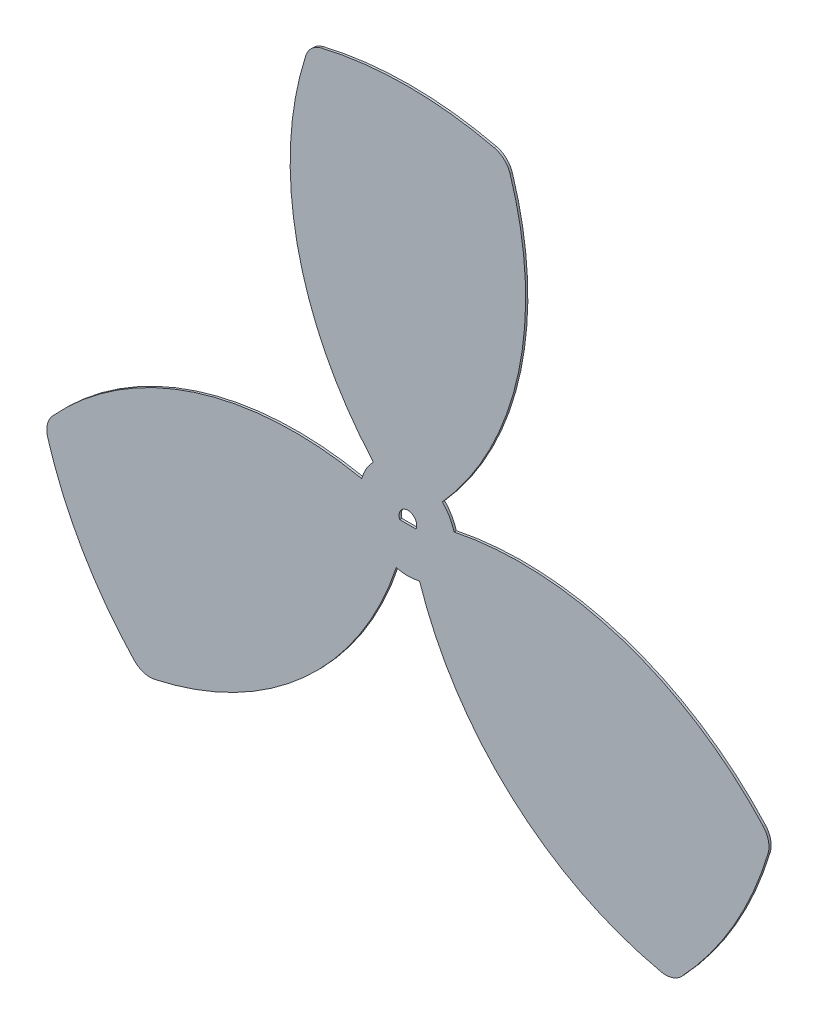
ISO-10303-21;
HEADER;
FILE_DESCRIPTION(('STEP AP214'),'2;1');
FILE_NAME('part.step','',(''),(''),'','','');
FILE_SCHEMA(('AUTOMOTIVE_DESIGN { 1 0 10303 214 1 1 1 1 }'));
ENDSEC;
DATA;
#1=APPLICATION_CONTEXT('core data for automotive mechanical design processes');
#2=APPLICATION_PROTOCOL_DEFINITION('international standard','automotive_design',2000,#1);
#3=PRODUCT_CONTEXT('',#1,'mechanical');
#4=PRODUCT('Part','Part','',(#3));
#5=PRODUCT_RELATED_PRODUCT_CATEGORY('part','',(#4));
#6=PRODUCT_DEFINITION_FORMATION('','',#4);
#7=PRODUCT_DEFINITION_CONTEXT('part definition',#1,'design');
#8=PRODUCT_DEFINITION('design','',#6,#7);
#9=PRODUCT_DEFINITION_SHAPE('','',#8);
#10=(LENGTH_UNIT() NAMED_UNIT(*) SI_UNIT(.MILLI.,.METRE.));
#11=(NAMED_UNIT(*) PLANE_ANGLE_UNIT() SI_UNIT($,.RADIAN.));
#12=(NAMED_UNIT(*) SI_UNIT($,.STERADIAN.) SOLID_ANGLE_UNIT());
#13=UNCERTAINTY_MEASURE_WITH_UNIT(LENGTH_MEASURE(1.E-05),#10,'distance_accuracy_value','');
#14=(GEOMETRIC_REPRESENTATION_CONTEXT(3) GLOBAL_UNCERTAINTY_ASSIGNED_CONTEXT((#13)) GLOBAL_UNIT_ASSIGNED_CONTEXT((#10,
#11,#12)) REPRESENTATION_CONTEXT('',''));
#15=CARTESIAN_POINT('',(0.,0.,0.));
#16=DIRECTION('',(0.,0.,1.));
#17=DIRECTION('',(1.,0.,0.));
#18=AXIS2_PLACEMENT_3D('',#15,#16,#17);
#19=CARTESIAN_POINT('',(51.7426711315438,150.346382184181,1.));
#20=DIRECTION('',(0.,0.,-1.));
#21=DIRECTION('',(-1.,0.,0.));
#22=AXIS2_PLACEMENT_3D('',#19,#20,#21);
#23=CYLINDRICAL_SURFACE('',#22,148.192977627793);
#24=CARTESIAN_POINT('',(51.7426711315438,150.346382184181,1.));
#25=DIRECTION('',(0.,0.,1.));
#26=DIRECTION('',(1.,0.,0.));
#27=AXIS2_PLACEMENT_3D('',#24,#25,#26);
#28=CIRCLE('',#27,148.192977627793);
#29=CARTESIAN_POINT('',(-89.4488248885642,195.358825683678,1.));
#30=VERTEX_POINT('',#29);
#31=CARTESIAN_POINT('',(-58.835372123024,51.6870948961489,1.));
#32=VERTEX_POINT('',#31);
#33=EDGE_CURVE('E196',#30,#32,#28,.T.);
#34=ORIENTED_EDGE('',*,*,#33,.F.);
#35=DIRECTION('',(0.,0.,-1.));
#36=VECTOR('',#35,1.);
#37=CARTESIAN_POINT('',(-89.4488248885642,195.358825683678,1.));
#38=LINE('',#37,#36);
#39=CARTESIAN_POINT('',(-89.4488248885642,195.358825683678,0.));
#40=VERTEX_POINT('',#39);
#41=EDGE_CURVE('E314',#30,#40,#38,.T.);
#42=ORIENTED_EDGE('',*,*,#41,.T.);
#43=CARTESIAN_POINT('',(51.7426711315438,150.346382184181,0.));
#44=DIRECTION('',(0.,0.,1.));
#45=DIRECTION('',(1.,0.,0.));
#46=AXIS2_PLACEMENT_3D('',#43,#44,#45);
#47=CIRCLE('',#46,148.192977627793);
#48=CARTESIAN_POINT('',(-58.835372123024,51.6870948961489,0.));
#49=VERTEX_POINT('',#48);
#50=EDGE_CURVE('E194',#40,#49,#47,.T.);
#51=ORIENTED_EDGE('',*,*,#50,.T.);
#52=DIRECTION('',(0.,0.,-1.));
#53=VECTOR('',#52,1.);
#54=CARTESIAN_POINT('',(-58.835372123024,51.6870948961489,1.));
#55=LINE('',#54,#53);
#56=EDGE_CURVE('E268',#32,#49,#55,.T.);
#57=ORIENTED_EDGE('',*,*,#56,.F.);
#58=EDGE_LOOP('',(#34,#42,#51,#57));
#59=FACE_BOUND('',#58,.T.);
#60=ADVANCED_FACE('F34',(#59),#23,.T.);
#61=CARTESIAN_POINT('',(-43.2289950101138,36.5854871082849,1.));
#62=DIRECTION('',(0.,0.,-1.));
#63=DIRECTION('',(-1.,0.,0.));
#64=AXIS2_PLACEMENT_3D('',#61,#62,#63);
#65=CYLINDRICAL_SURFACE('',#64,21.7167576854567);
#66=CARTESIAN_POINT('',(-43.2289950101138,36.5854871082849,0.));
#67=DIRECTION('',(0.,0.,1.));
#68=DIRECTION('',(1.,0.,0.));
#69=AXIS2_PLACEMENT_3D('',#66,#67,#68);
#70=CIRCLE('',#69,21.7167576854567);
#71=CARTESIAN_POINT('',(-64.1105595488485,42.5502022551718,0.));
#72=VERTEX_POINT('',#71);
#73=EDGE_CURVE('E228',#49,#72,#70,.T.);
#74=ORIENTED_EDGE('',*,*,#73,.T.);
#75=DIRECTION('',(0.,0.,-1.));
#76=VECTOR('',#75,1.);
#77=CARTESIAN_POINT('',(-64.1105595488485,42.5502022551718,1.));
#78=LINE('',#77,#76);
#79=CARTESIAN_POINT('',(-64.1105595488485,42.5502022551718,1.));
#80=VERTEX_POINT('',#79);
#81=EDGE_CURVE('E265',#80,#72,#78,.T.);
#82=ORIENTED_EDGE('',*,*,#81,.F.);
#83=CARTESIAN_POINT('',(-43.2289950101138,36.5854871082849,1.));
#84=DIRECTION('',(0.,0.,1.));
#85=DIRECTION('',(1.,0.,0.));
#86=AXIS2_PLACEMENT_3D('',#83,#84,#85);
#87=CIRCLE('',#86,21.7167576854567);
#88=EDGE_CURVE('E198',#32,#80,#87,.T.);
#89=ORIENTED_EDGE('',*,*,#88,.F.);
#90=ORIENTED_EDGE('',*,*,#56,.T.);
#91=EDGE_LOOP('',(#74,#82,#89,#90));
#92=FACE_BOUND('',#91,.T.);
#93=ADVANCED_FACE('F340',(#92),#65,.T.);
#94=CARTESIAN_POINT('',(-94.2629870322673,-102.542835948076,1.));
#95=DIRECTION('',(0.,0.,-1.));
#96=DIRECTION('',(-1.,0.,0.));
#97=AXIS2_PLACEMENT_3D('',#94,#95,#96);
#98=CYLINDRICAL_SURFACE('',#97,148.192977627794);
#99=CARTESIAN_POINT('',(-94.2629870322673,-102.542835948076,0.));
#100=DIRECTION('',(0.,0.,1.));
#101=DIRECTION('',(1.,0.,0.));
#102=AXIS2_PLACEMENT_3D('',#99,#100,#101);
#103=CIRCLE('',#102,148.192977627794);
#104=CARTESIAN_POINT('',(-203.840654599297,-2.77363534607959,0.));
#105=VERTEX_POINT('',#104);
#106=EDGE_CURVE('E231',#105,#72,#103,.F.);
#107=ORIENTED_EDGE('',*,*,#106,.F.);
#108=DIRECTION('',(0.,0.,-1.));
#109=VECTOR('',#108,1.);
#110=CARTESIAN_POINT('',(-203.840654599297,-2.77363534607959,1.));
#111=LINE('',#110,#109);
#112=CARTESIAN_POINT('',(-203.840654599297,-2.77363534607959,1.));
#113=VERTEX_POINT('',#112);
#114=EDGE_CURVE('E312',#105,#113,#111,.F.);
#115=ORIENTED_EDGE('',*,*,#114,.T.);
#116=CARTESIAN_POINT('',(-94.2629870322673,-102.542835948076,1.));
#117=DIRECTION('',(0.,0.,1.));
#118=DIRECTION('',(1.,0.,0.));
#119=AXIS2_PLACEMENT_3D('',#116,#117,#118);
#120=CIRCLE('',#119,148.192977627794);
#121=EDGE_CURVE('E202',#113,#80,#120,.F.);
#122=ORIENTED_EDGE('',*,*,#121,.T.);
#123=ORIENTED_EDGE('',*,*,#81,.T.);
#124=EDGE_LOOP('',(#107,#115,#122,#123));
#125=FACE_BOUND('',#124,.T.);
#126=ADVANCED_FACE('F343',(#125),#98,.T.);
#127=CARTESIAN_POINT('',(-43.2289950101138,36.5854871082849,1.));
#128=DIRECTION('',(0.,0.,-1.));
#129=DIRECTION('',(-1.,0.,0.));
#130=AXIS2_PLACEMENT_3D('',#127,#128,#129);
#131=CYLINDRICAL_SURFACE('',#130,170.000000000001);
#132=CARTESIAN_POINT('',(-43.2289950101138,36.5854871082849,0.));
#133=DIRECTION('',(0.,0.,1.));
#134=DIRECTION('',(1.,0.,0.));
#135=AXIS2_PLACEMENT_3D('',#132,#133,#134);
#136=CIRCLE('',#135,170.000000000001);
#137=CARTESIAN_POINT('',(-206.022487315277,-12.386738316838,0.));
#138=VERTEX_POINT('',#137);
#139=CARTESIAN_POINT('',(-167.036932460708,-79.911700086213,0.));
#140=VERTEX_POINT('',#139);
#141=EDGE_CURVE('E233',#138,#140,#136,.T.);
#142=ORIENTED_EDGE('',*,*,#141,.T.);
#143=DIRECTION('',(0.,0.,-1.));
#144=VECTOR('',#143,1.);
#145=CARTESIAN_POINT('',(-167.036932460708,-79.911700086213,1.));
#146=LINE('',#145,#144);
#147=CARTESIAN_POINT('',(-167.036932460708,-79.911700086213,1.));
#148=VERTEX_POINT('',#147);
#149=EDGE_CURVE('E310',#140,#148,#146,.F.);
#150=ORIENTED_EDGE('',*,*,#149,.T.);
#151=CARTESIAN_POINT('',(-43.2289950101138,36.5854871082849,1.));
#152=DIRECTION('',(0.,0.,1.));
#153=DIRECTION('',(1.,0.,0.));
#154=AXIS2_PLACEMENT_3D('',#151,#152,#153);
#155=CIRCLE('',#154,170.000000000001);
#156=CARTESIAN_POINT('',(-206.022487315277,-12.386738316838,1.));
#157=VERTEX_POINT('',#156);
#158=EDGE_CURVE('E204',#157,#148,#155,.T.);
#159=ORIENTED_EDGE('',*,*,#158,.F.);
#160=DIRECTION('',(0.,0.,-1.));
#161=VECTOR('',#160,1.);
#162=CARTESIAN_POINT('',(-206.022487315277,-12.386738316838,1.));
#163=LINE('',#162,#161);
#164=EDGE_CURVE('E307',#157,#138,#163,.T.);
#165=ORIENTED_EDGE('',*,*,#164,.T.);
#166=EDGE_LOOP('',(#142,#150,#159,#165));
#167=FACE_BOUND('',#166,.T.);
#168=ADVANCED_FACE('F352',(#167),#131,.T.);
#169=CARTESIAN_POINT('',(-189.234653173923,61.9529150887447,1.));
#170=DIRECTION('',(0.,0.,-1.));
#171=DIRECTION('',(-1.,0.,0.));
#172=AXIS2_PLACEMENT_3D('',#169,#170,#171);
#173=CYLINDRICAL_SURFACE('',#172,148.192977627792);
#174=CARTESIAN_POINT('',(-189.234653173923,61.9529150887447,1.));
#175=DIRECTION('',(0.,0.,1.));
#176=DIRECTION('',(1.,0.,0.));
#177=AXIS2_PLACEMENT_3D('',#174,#175,#176);
#178=CIRCLE('',#177,148.192977627792);
#179=CARTESIAN_POINT('',(-157.620824720846,-82.828729012746,1.));
#180=VERTEX_POINT('',#179);
#181=CARTESIAN_POINT('',(-48.5041824359368,15.5191641735324,1.));
#182=VERTEX_POINT('',#181);
#183=EDGE_CURVE('E207',#180,#182,#178,.T.);
#184=ORIENTED_EDGE('',*,*,#183,.F.);
#185=DIRECTION('',(0.,0.,-1.));
#186=VECTOR('',#185,1.);
#187=CARTESIAN_POINT('',(-157.620824720846,-82.828729012746,1.));
#188=LINE('',#187,#186);
#189=CARTESIAN_POINT('',(-157.620824720846,-82.828729012746,0.));
#190=VERTEX_POINT('',#189);
#191=EDGE_CURVE('E304',#180,#190,#188,.T.);
#192=ORIENTED_EDGE('',*,*,#191,.T.);
#193=CARTESIAN_POINT('',(-189.234653173923,61.9529150887447,0.));
#194=DIRECTION('',(0.,0.,1.));
#195=DIRECTION('',(1.,0.,0.));
#196=AXIS2_PLACEMENT_3D('',#193,#194,#195);
#197=CIRCLE('',#196,148.192977627792);
#198=CARTESIAN_POINT('',(-48.5041824359368,15.5191641735324,0.));
#199=VERTEX_POINT('',#198);
#200=EDGE_CURVE('E236',#190,#199,#197,.T.);
#201=ORIENTED_EDGE('',*,*,#200,.T.);
#202=DIRECTION('',(0.,0.,-1.));
#203=VECTOR('',#202,1.);
#204=CARTESIAN_POINT('',(-48.5041824359368,15.5191641735324,1.));
#205=LINE('',#204,#203);
#206=EDGE_CURVE('E262',#182,#199,#205,.T.);
#207=ORIENTED_EDGE('',*,*,#206,.F.);
#208=EDGE_LOOP('',(#184,#192,#201,#207));
#209=FACE_BOUND('',#208,.T.);
#210=ADVANCED_FACE('F362',(#209),#173,.T.);
#211=CARTESIAN_POINT('',(-43.2289950101138,36.5854871082849,1.));
#212=DIRECTION('',(0.,0.,-1.));
#213=DIRECTION('',(-1.,0.,0.));
#214=AXIS2_PLACEMENT_3D('',#211,#212,#213);
#215=CYLINDRICAL_SURFACE('',#214,21.7167576854567);
#216=CARTESIAN_POINT('',(-43.2289950101138,36.5854871082849,0.));
#217=DIRECTION('',(0.,0.,1.));
#218=DIRECTION('',(1.,0.,0.));
#219=AXIS2_PLACEMENT_3D('',#216,#217,#218);
#220=CIRCLE('',#219,21.7167576854567);
#221=CARTESIAN_POINT('',(-37.9538075842884,15.519164173533,0.));
#222=VERTEX_POINT('',#221);
#223=EDGE_CURVE('E238',#199,#222,#220,.T.);
#224=ORIENTED_EDGE('',*,*,#223,.T.);
#225=DIRECTION('',(0.,0.,-1.));
#226=VECTOR('',#225,1.);
#227=CARTESIAN_POINT('',(-37.9538075842884,15.519164173533,1.));
#228=LINE('',#227,#226);
#229=CARTESIAN_POINT('',(-37.9538075842884,15.519164173533,1.));
#230=VERTEX_POINT('',#229);
#231=EDGE_CURVE('E259',#230,#222,#228,.T.);
#232=ORIENTED_EDGE('',*,*,#231,.F.);
#233=CARTESIAN_POINT('',(-43.2289950101138,36.5854871082849,1.));
#234=DIRECTION('',(0.,0.,1.));
#235=DIRECTION('',(1.,0.,0.));
#236=AXIS2_PLACEMENT_3D('',#233,#234,#235);
#237=CIRCLE('',#236,21.7167576854567);
#238=EDGE_CURVE('E209',#182,#230,#237,.T.);
#239=ORIENTED_EDGE('',*,*,#238,.F.);
#240=ORIENTED_EDGE('',*,*,#206,.T.);
#241=EDGE_LOOP('',(#224,#232,#239,#240));
#242=FACE_BOUND('',#241,.T.);
#243=ADVANCED_FACE('F369',(#242),#215,.T.);
#244=CARTESIAN_POINT('',(102.776663153701,61.9529150887455,1.));
#245=DIRECTION('',(0.,0.,-1.));
#246=DIRECTION('',(-1.,0.,0.));
#247=AXIS2_PLACEMENT_3D('',#244,#245,#246);
#248=CYLINDRICAL_SURFACE('',#247,148.192977627795);
#249=CARTESIAN_POINT('',(102.776663153701,61.9529150887455,0.));
#250=DIRECTION('',(0.,0.,1.));
#251=DIRECTION('',(1.,0.,0.));
#252=AXIS2_PLACEMENT_3D('',#249,#250,#251);
#253=CIRCLE('',#252,148.192977627795);
#254=CARTESIAN_POINT('',(71.1628347006211,-82.8287290127473,0.));
#255=VERTEX_POINT('',#254);
#256=EDGE_CURVE('E241',#255,#222,#253,.F.);
#257=ORIENTED_EDGE('',*,*,#256,.F.);
#258=DIRECTION('',(0.,0.,-1.));
#259=VECTOR('',#258,1.);
#260=CARTESIAN_POINT('',(71.1628347006211,-82.8287290127473,1.));
#261=LINE('',#260,#259);
#262=CARTESIAN_POINT('',(71.1628347006211,-82.8287290127473,1.));
#263=VERTEX_POINT('',#262);
#264=EDGE_CURVE('E302',#255,#263,#261,.F.);
#265=ORIENTED_EDGE('',*,*,#264,.T.);
#266=CARTESIAN_POINT('',(102.776663153701,61.9529150887455,1.));
#267=DIRECTION('',(0.,0.,1.));
#268=DIRECTION('',(1.,0.,0.));
#269=AXIS2_PLACEMENT_3D('',#266,#267,#268);
#270=CIRCLE('',#269,148.192977627795);
#271=EDGE_CURVE('E212',#263,#230,#270,.F.);
#272=ORIENTED_EDGE('',*,*,#271,.T.);
#273=ORIENTED_EDGE('',*,*,#231,.T.);
#274=EDGE_LOOP('',(#257,#265,#272,#273));
#275=FACE_BOUND('',#274,.T.);
#276=ADVANCED_FACE('F372',(#275),#248,.T.);
#277=CARTESIAN_POINT('',(-43.2289950101138,36.5854871082849,1.));
#278=DIRECTION('',(0.,0.,-1.));
#279=DIRECTION('',(-1.,0.,0.));
#280=AXIS2_PLACEMENT_3D('',#277,#278,#279);
#281=CYLINDRICAL_SURFACE('',#280,170.000000000003);
#282=CARTESIAN_POINT('',(-43.2289950101138,36.5854871082849,0.));
#283=DIRECTION('',(0.,0.,1.));
#284=DIRECTION('',(1.,0.,0.));
#285=AXIS2_PLACEMENT_3D('',#282,#283,#284);
#286=CIRCLE('',#285,170.000000000003);
#287=CARTESIAN_POINT('',(80.5789424404832,-79.9117000862143,0.));
#288=VERTEX_POINT('',#287);
#289=CARTESIAN_POINT('',(119.564497295052,-12.3867383168368,0.));
#290=VERTEX_POINT('',#289);
#291=EDGE_CURVE('E243',#288,#290,#286,.T.);
#292=ORIENTED_EDGE('',*,*,#291,.T.);
#293=DIRECTION('',(0.,0.,-1.));
#294=VECTOR('',#293,1.);
#295=CARTESIAN_POINT('',(119.564497295052,-12.3867383168369,1.));
#296=LINE('',#295,#294);
#297=CARTESIAN_POINT('',(119.564497295052,-12.3867383168368,1.));
#298=VERTEX_POINT('',#297);
#299=EDGE_CURVE('E289',#290,#298,#296,.F.);
#300=ORIENTED_EDGE('',*,*,#299,.T.);
#301=CARTESIAN_POINT('',(-43.2289950101138,36.5854871082849,1.));
#302=DIRECTION('',(0.,0.,1.));
#303=DIRECTION('',(1.,0.,0.));
#304=AXIS2_PLACEMENT_3D('',#301,#302,#303);
#305=CIRCLE('',#304,170.000000000003);
#306=CARTESIAN_POINT('',(80.5789424404832,-79.9117000862143,1.));
#307=VERTEX_POINT('',#306);
#308=EDGE_CURVE('E214',#307,#298,#305,.T.);
#309=ORIENTED_EDGE('',*,*,#308,.F.);
#310=DIRECTION('',(0.,0.,-1.));
#311=VECTOR('',#310,1.);
#312=CARTESIAN_POINT('',(80.5789424404832,-79.9117000862143,1.));
#313=LINE('',#312,#311);
#314=EDGE_CURVE('E286',#307,#288,#313,.T.);
#315=ORIENTED_EDGE('',*,*,#314,.T.);
#316=EDGE_LOOP('',(#292,#300,#309,#315));
#317=FACE_BOUND('',#316,.T.);
#318=ADVANCED_FACE('F380',(#317),#281,.T.);
#319=CARTESIAN_POINT('',(7.80499701204253,-102.542835948074,1.));
#320=DIRECTION('',(0.,0.,-1.));
#321=DIRECTION('',(-1.,0.,0.));
#322=AXIS2_PLACEMENT_3D('',#319,#320,#321);
#323=CYLINDRICAL_SURFACE('',#322,148.192977627794);
#324=CARTESIAN_POINT('',(7.80499701204253,-102.542835948074,1.));
#325=DIRECTION('',(0.,0.,1.));
#326=DIRECTION('',(1.,0.,0.));
#327=AXIS2_PLACEMENT_3D('',#324,#325,#326);
#328=CIRCLE('',#327,148.192977627794);
#329=CARTESIAN_POINT('',(117.382664579073,-2.77363534607858,1.));
#330=VERTEX_POINT('',#329);
#331=CARTESIAN_POINT('',(-22.3474304713795,42.5502022551728,1.));
#332=VERTEX_POINT('',#331);
#333=EDGE_CURVE('E217',#330,#332,#328,.T.);
#334=ORIENTED_EDGE('',*,*,#333,.F.);
#335=DIRECTION('',(0.,0.,-1.));
#336=VECTOR('',#335,1.);
#337=CARTESIAN_POINT('',(117.382664579073,-2.77363534607858,1.));
#338=LINE('',#337,#336);
#339=CARTESIAN_POINT('',(117.382664579073,-2.77363534607858,0.));
#340=VERTEX_POINT('',#339);
#341=EDGE_CURVE('E271',#330,#340,#338,.T.);
#342=ORIENTED_EDGE('',*,*,#341,.T.);
#343=CARTESIAN_POINT('',(7.80499701204253,-102.542835948074,0.));
#344=DIRECTION('',(0.,0.,1.));
#345=DIRECTION('',(1.,0.,0.));
#346=AXIS2_PLACEMENT_3D('',#343,#344,#345);
#347=CIRCLE('',#346,148.192977627794);
#348=CARTESIAN_POINT('',(-22.3474304713795,42.5502022551728,0.));
#349=VERTEX_POINT('',#348);
#350=EDGE_CURVE('E246',#340,#349,#347,.T.);
#351=ORIENTED_EDGE('',*,*,#350,.T.);
#352=DIRECTION('',(0.,0.,-1.));
#353=VECTOR('',#352,1.);
#354=CARTESIAN_POINT('',(-22.3474304713795,42.5502022551728,1.));
#355=LINE('',#354,#353);
#356=EDGE_CURVE('E256',#332,#349,#355,.T.);
#357=ORIENTED_EDGE('',*,*,#356,.F.);
#358=EDGE_LOOP('',(#334,#342,#351,#357));
#359=FACE_BOUND('',#358,.T.);
#360=ADVANCED_FACE('F389',(#359),#323,.T.);
#361=CARTESIAN_POINT('',(-43.2289950101138,36.5854871082849,1.));
#362=DIRECTION('',(0.,0.,-1.));
#363=DIRECTION('',(-1.,0.,0.));
#364=AXIS2_PLACEMENT_3D('',#361,#362,#363);
#365=CYLINDRICAL_SURFACE('',#364,21.7167576854567);
#366=CARTESIAN_POINT('',(-43.2289950101138,36.5854871082849,0.));
#367=DIRECTION('',(0.,0.,1.));
#368=DIRECTION('',(1.,0.,0.));
#369=AXIS2_PLACEMENT_3D('',#366,#367,#368);
#370=CIRCLE('',#369,21.7167576854567);
#371=CARTESIAN_POINT('',(-27.6226178972036,51.6870948961489,0.));
#372=VERTEX_POINT('',#371);
#373=EDGE_CURVE('E248',#349,#372,#370,.T.);
#374=ORIENTED_EDGE('',*,*,#373,.T.);
#375=DIRECTION('',(0.,0.,-1.));
#376=VECTOR('',#375,1.);
#377=CARTESIAN_POINT('',(-27.6226178972036,51.6870948961489,1.));
#378=LINE('',#377,#376);
#379=CARTESIAN_POINT('',(-27.6226178972036,51.6870948961489,1.));
#380=VERTEX_POINT('',#379);
#381=EDGE_CURVE('E226',#380,#372,#378,.T.);
#382=ORIENTED_EDGE('',*,*,#381,.F.);
#383=CARTESIAN_POINT('',(-43.2289950101138,36.5854871082849,1.));
#384=DIRECTION('',(0.,0.,1.));
#385=DIRECTION('',(1.,0.,0.));
#386=AXIS2_PLACEMENT_3D('',#383,#384,#385);
#387=CIRCLE('',#386,21.7167576854567);
#388=EDGE_CURVE('E219',#332,#380,#387,.T.);
#389=ORIENTED_EDGE('',*,*,#388,.F.);
#390=ORIENTED_EDGE('',*,*,#356,.T.);
#391=EDGE_LOOP('',(#374,#382,#389,#390));
#392=FACE_BOUND('',#391,.T.);
#393=ADVANCED_FACE('F394',(#392),#365,.T.);
#394=CARTESIAN_POINT('',(-138.200661151771,150.346382184181,1.));
#395=DIRECTION('',(0.,0.,-1.));
#396=DIRECTION('',(-1.,0.,0.));
#397=AXIS2_PLACEMENT_3D('',#394,#395,#396);
#398=CYLINDRICAL_SURFACE('',#397,148.192977627793);
#399=CARTESIAN_POINT('',(-138.200661151771,150.346382184181,0.));
#400=DIRECTION('',(0.,0.,1.));
#401=DIRECTION('',(1.,0.,0.));
#402=AXIS2_PLACEMENT_3D('',#399,#400,#401);
#403=CIRCLE('',#402,148.192977627793);
#404=CARTESIAN_POINT('',(2.99083486833651,195.358825683678,0.));
#405=VERTEX_POINT('',#404);
#406=EDGE_CURVE('E251',#405,#372,#403,.F.);
#407=ORIENTED_EDGE('',*,*,#406,.F.);
#408=DIRECTION('',(0.,0.,-1.));
#409=VECTOR('',#408,1.);
#410=CARTESIAN_POINT('',(2.99083486833651,195.358825683678,1.));
#411=LINE('',#410,#409);
#412=CARTESIAN_POINT('',(2.99083486833651,195.358825683678,1.));
#413=VERTEX_POINT('',#412);
#414=EDGE_CURVE('E11',#405,#413,#411,.F.);
#415=ORIENTED_EDGE('',*,*,#414,.T.);
#416=CARTESIAN_POINT('',(-138.200661151771,150.346382184181,1.));
#417=DIRECTION('',(0.,0.,1.));
#418=DIRECTION('',(1.,0.,0.));
#419=AXIS2_PLACEMENT_3D('',#416,#417,#418);
#420=CIRCLE('',#419,148.192977627793);
#421=EDGE_CURVE('E222',#413,#380,#420,.F.);
#422=ORIENTED_EDGE('',*,*,#421,.T.);
#423=ORIENTED_EDGE('',*,*,#381,.T.);
#424=EDGE_LOOP('',(#407,#415,#422,#423));
#425=FACE_BOUND('',#424,.T.);
#426=ADVANCED_FACE('F397',(#425),#398,.T.);
#427=CARTESIAN_POINT('',(-43.2289950101138,36.5854871082849,1.));
#428=DIRECTION('',(0.,0.,-1.));
#429=DIRECTION('',(-1.,0.,0.));
#430=AXIS2_PLACEMENT_3D('',#427,#428,#429);
#431=CYLINDRICAL_SURFACE('',#430,170.);
#432=CARTESIAN_POINT('',(-43.2289950101138,36.5854871082849,0.));
#433=DIRECTION('',(0.,0.,1.));
#434=DIRECTION('',(1.,0.,0.));
#435=AXIS2_PLACEMENT_3D('',#432,#433,#434);
#436=CIRCLE('',#435,170.);
#437=CARTESIAN_POINT('',(-4.24344015554617,202.054899727903,0.));
#438=VERTEX_POINT('',#437);
#439=CARTESIAN_POINT('',(-82.2145498646815,202.054899727903,0.));
#440=VERTEX_POINT('',#439);
#441=EDGE_CURVE('E199',#438,#440,#436,.T.);
#442=ORIENTED_EDGE('',*,*,#441,.T.);
#443=DIRECTION('',(0.,0.,-1.));
#444=VECTOR('',#443,1.);
#445=CARTESIAN_POINT('',(-82.2145498646815,202.054899727903,1.));
#446=LINE('',#445,#444);
#447=CARTESIAN_POINT('',(-82.2145498646815,202.054899727903,1.));
#448=VERTEX_POINT('',#447);
#449=EDGE_CURVE('E42',#440,#448,#446,.F.);
#450=ORIENTED_EDGE('',*,*,#449,.T.);
#451=CARTESIAN_POINT('',(-43.2289950101138,36.5854871082849,1.));
#452=DIRECTION('',(0.,0.,1.));
#453=DIRECTION('',(1.,0.,0.));
#454=AXIS2_PLACEMENT_3D('',#451,#452,#453);
#455=CIRCLE('',#454,170.);
#456=CARTESIAN_POINT('',(-4.24344015554617,202.054899727903,1.));
#457=VERTEX_POINT('',#456);
#458=EDGE_CURVE('E224',#457,#448,#455,.T.);
#459=ORIENTED_EDGE('',*,*,#458,.F.);
#460=DIRECTION('',(0.,0.,-1.));
#461=VECTOR('',#460,1.);
#462=CARTESIAN_POINT('',(-4.24344015554617,202.054899727903,1.));
#463=LINE('',#462,#461);
#464=EDGE_CURVE('E317',#457,#438,#463,.T.);
#465=ORIENTED_EDGE('',*,*,#464,.T.);
#466=EDGE_LOOP('',(#442,#450,#459,#465));
#467=FACE_BOUND('',#466,.T.);
#468=ADVANCED_FACE('F321',(#467),#431,.T.);
#469=CARTESIAN_POINT('',(0.,0.,1.));
#470=DIRECTION('',(0.,0.,1.));
#471=DIRECTION('',(1.,0.,0.));
#472=AXIS2_PLACEMENT_3D('',#469,#470,#471);
#473=PLANE('',#472);
#474=CARTESIAN_POINT('',(-43.2289950101138,36.5854871082849,1.));
#475=DIRECTION('',(0.,0.,-1.));
#476=DIRECTION('',(1.,0.,0.));
#477=AXIS2_PLACEMENT_3D('',#474,#475,#476);
#478=CIRCLE('',#477,4.00000000000001);
#479=CARTESIAN_POINT('',(-46.9370942536617,35.0854871082849,1.));
#480=VERTEX_POINT('',#479);
#481=CARTESIAN_POINT('',(-39.520895766566,35.0854871082849,1.));
#482=VERTEX_POINT('',#481);
#483=EDGE_CURVE('E174',#480,#482,#478,.T.);
#484=ORIENTED_EDGE('',*,*,#483,.T.);
#485=DIRECTION('',(-1.,0.,0.));
#486=VECTOR('',#485,1.);
#487=CARTESIAN_POINT('',(-46.9370942536617,35.0854871082849,1.));
#488=LINE('',#487,#486);
#489=EDGE_CURVE('E182',#482,#480,#488,.T.);
#490=ORIENTED_EDGE('',*,*,#489,.T.);
#491=EDGE_LOOP('',(#484,#490));
#492=FACE_BOUND('',#491,.T.);
#493=ORIENTED_EDGE('',*,*,#308,.T.);
#494=CARTESIAN_POINT('',(109.988409512396,-9.50601917418269,1.));
#495=DIRECTION('',(0.,0.,1.));
#496=DIRECTION('',(1.,0.,0.));
#497=AXIS2_PLACEMENT_3D('',#494,#495,#496);
#498=CIRCLE('',#497,10.);
#499=EDGE_CURVE('E300',#298,#330,#498,.T.);
#500=ORIENTED_EDGE('',*,*,#499,.T.);
#501=ORIENTED_EDGE('',*,*,#333,.T.);
#502=ORIENTED_EDGE('',*,*,#388,.T.);
#503=ORIENTED_EDGE('',*,*,#421,.F.);
#504=CARTESIAN_POINT('',(-6.53670808816779,192.321404867926,1.));
#505=DIRECTION('',(0.,0.,1.));
#506=DIRECTION('',(1.,0.,0.));
#507=AXIS2_PLACEMENT_3D('',#504,#505,#506);
#508=CIRCLE('',#507,10.);
#509=EDGE_CURVE('E55',#413,#457,#508,.T.);
#510=ORIENTED_EDGE('',*,*,#509,.T.);
#511=ORIENTED_EDGE('',*,*,#458,.T.);
#512=CARTESIAN_POINT('',(-79.9212819320599,192.321404867926,1.));
#513=DIRECTION('',(0.,0.,1.));
#514=DIRECTION('',(1.,0.,0.));
#515=AXIS2_PLACEMENT_3D('',#512,#513,#514);
#516=CIRCLE('',#515,10.);
#517=EDGE_CURVE('E292',#448,#30,#516,.T.);
#518=ORIENTED_EDGE('',*,*,#517,.T.);
#519=ORIENTED_EDGE('',*,*,#33,.T.);
#520=ORIENTED_EDGE('',*,*,#88,.T.);
#521=ORIENTED_EDGE('',*,*,#121,.F.);
#522=CARTESIAN_POINT('',(-196.44639953262,-9.50601917418375,1.));
#523=DIRECTION('',(0.,0.,1.));
#524=DIRECTION('',(1.,0.,0.));
#525=AXIS2_PLACEMENT_3D('',#522,#523,#524);
#526=CIRCLE('',#525,10.);
#527=EDGE_CURVE('E294',#113,#157,#526,.T.);
#528=ORIENTED_EDGE('',*,*,#527,.T.);
#529=ORIENTED_EDGE('',*,*,#158,.T.);
#530=CARTESIAN_POINT('',(-159.754112610673,-73.0589243688896,1.));
#531=DIRECTION('',(0.,0.,1.));
#532=DIRECTION('',(1.,0.,0.));
#533=AXIS2_PLACEMENT_3D('',#530,#531,#532);
#534=CIRCLE('',#533,10.);
#535=EDGE_CURVE('E296',#148,#180,#534,.T.);
#536=ORIENTED_EDGE('',*,*,#535,.T.);
#537=ORIENTED_EDGE('',*,*,#183,.T.);
#538=ORIENTED_EDGE('',*,*,#238,.T.);
#539=ORIENTED_EDGE('',*,*,#271,.F.);
#540=CARTESIAN_POINT('',(73.2961225904483,-73.058924368891,1.));
#541=DIRECTION('',(0.,0.,1.));
#542=DIRECTION('',(1.,0.,0.));
#543=AXIS2_PLACEMENT_3D('',#540,#541,#542);
#544=CIRCLE('',#543,10.);
#545=EDGE_CURVE('E298',#263,#307,#544,.T.);
#546=ORIENTED_EDGE('',*,*,#545,.T.);
#547=EDGE_LOOP('',(#493,#500,#501,#502,#503,#510,#511,#518,#519,#520,#521,#528,#529,#536,#537,
#538,#539,#546));
#548=FACE_BOUND('',#547,.T.);
#549=ADVANCED_FACE('F188',(#492,#548),#473,.T.);
#550=CARTESIAN_POINT('',(0.,0.,0.));
#551=DIRECTION('',(0.,0.,1.));
#552=DIRECTION('',(1.,0.,0.));
#553=AXIS2_PLACEMENT_3D('',#550,#551,#552);
#554=PLANE('',#553);
#555=DIRECTION('',(-1.,0.,0.));
#556=VECTOR('',#555,1.);
#557=CARTESIAN_POINT('',(-46.9370942536617,35.0854871082849,0.));
#558=LINE('',#557,#556);
#559=CARTESIAN_POINT('',(-39.520895766566,35.0854871082849,0.));
#560=VERTEX_POINT('',#559);
#561=CARTESIAN_POINT('',(-46.9370942536617,35.0854871082849,0.));
#562=VERTEX_POINT('',#561);
#563=EDGE_CURVE('E189',#560,#562,#558,.T.);
#564=ORIENTED_EDGE('',*,*,#563,.F.);
#565=CARTESIAN_POINT('',(-43.2289950101138,36.5854871082849,0.));
#566=DIRECTION('',(0.,0.,-1.));
#567=DIRECTION('',(1.,0.,0.));
#568=AXIS2_PLACEMENT_3D('',#565,#566,#567);
#569=CIRCLE('',#568,4.00000000000001);
#570=EDGE_CURVE('E177',#562,#560,#569,.T.);
#571=ORIENTED_EDGE('',*,*,#570,.F.);
#572=EDGE_LOOP('',(#564,#571));
#573=FACE_BOUND('',#572,.T.);
#574=ORIENTED_EDGE('',*,*,#350,.F.);
#575=CARTESIAN_POINT('',(109.988409512396,-9.50601917418269,0.));
#576=DIRECTION('',(0.,0.,1.));
#577=DIRECTION('',(1.,0.,0.));
#578=AXIS2_PLACEMENT_3D('',#575,#576,#577);
#579=CIRCLE('',#578,10.);
#580=EDGE_CURVE('E284',#340,#290,#579,.F.);
#581=ORIENTED_EDGE('',*,*,#580,.T.);
#582=ORIENTED_EDGE('',*,*,#291,.F.);
#583=CARTESIAN_POINT('',(73.2961225904483,-73.058924368891,0.));
#584=DIRECTION('',(0.,0.,1.));
#585=DIRECTION('',(1.,0.,0.));
#586=AXIS2_PLACEMENT_3D('',#583,#584,#585);
#587=CIRCLE('',#586,10.);
#588=EDGE_CURVE('E282',#288,#255,#587,.F.);
#589=ORIENTED_EDGE('',*,*,#588,.T.);
#590=ORIENTED_EDGE('',*,*,#256,.T.);
#591=ORIENTED_EDGE('',*,*,#223,.F.);
#592=ORIENTED_EDGE('',*,*,#200,.F.);
#593=CARTESIAN_POINT('',(-159.754112610673,-73.0589243688896,0.));
#594=DIRECTION('',(0.,0.,1.));
#595=DIRECTION('',(1.,0.,0.));
#596=AXIS2_PLACEMENT_3D('',#593,#594,#595);
#597=CIRCLE('',#596,10.);
#598=EDGE_CURVE('E280',#190,#140,#597,.F.);
#599=ORIENTED_EDGE('',*,*,#598,.T.);
#600=ORIENTED_EDGE('',*,*,#141,.F.);
#601=CARTESIAN_POINT('',(-196.44639953262,-9.50601917418375,0.));
#602=DIRECTION('',(0.,0.,1.));
#603=DIRECTION('',(1.,0.,0.));
#604=AXIS2_PLACEMENT_3D('',#601,#602,#603);
#605=CIRCLE('',#604,10.);
#606=EDGE_CURVE('E278',#138,#105,#605,.F.);
#607=ORIENTED_EDGE('',*,*,#606,.T.);
#608=ORIENTED_EDGE('',*,*,#106,.T.);
#609=ORIENTED_EDGE('',*,*,#73,.F.);
#610=ORIENTED_EDGE('',*,*,#50,.F.);
#611=CARTESIAN_POINT('',(-79.9212819320599,192.321404867926,0.));
#612=DIRECTION('',(0.,0.,1.));
#613=DIRECTION('',(1.,0.,0.));
#614=AXIS2_PLACEMENT_3D('',#611,#612,#613);
#615=CIRCLE('',#614,10.);
#616=EDGE_CURVE('E276',#40,#440,#615,.F.);
#617=ORIENTED_EDGE('',*,*,#616,.T.);
#618=ORIENTED_EDGE('',*,*,#441,.F.);
#619=CARTESIAN_POINT('',(-6.53670808816779,192.321404867926,0.));
#620=DIRECTION('',(0.,0.,1.));
#621=DIRECTION('',(1.,0.,0.));
#622=AXIS2_PLACEMENT_3D('',#619,#620,#621);
#623=CIRCLE('',#622,10.);
#624=EDGE_CURVE('E274',#438,#405,#623,.F.);
#625=ORIENTED_EDGE('',*,*,#624,.T.);
#626=ORIENTED_EDGE('',*,*,#406,.T.);
#627=ORIENTED_EDGE('',*,*,#373,.F.);
#628=EDGE_LOOP('',(#574,#581,#582,#589,#590,#591,#592,#599,#600,#607,#608,#609,#610,#617,#618,
#625,#626,#627));
#629=FACE_BOUND('',#628,.T.);
#630=ADVANCED_FACE('F325',(#573,#629),#554,.F.);
#631=CARTESIAN_POINT('',(-43.2289950101138,36.5854871082849,1.));
#632=DIRECTION('',(0.,0.,-1.));
#633=DIRECTION('',(-1.,0.,0.));
#634=AXIS2_PLACEMENT_3D('',#631,#632,#633);
#635=CYLINDRICAL_SURFACE('',#634,4.00000000000001);
#636=ORIENTED_EDGE('',*,*,#570,.T.);
#637=DIRECTION('',(0.,0.,-1.));
#638=VECTOR('',#637,1.);
#639=CARTESIAN_POINT('',(-39.520895766566,35.0854871082849,1.));
#640=LINE('',#639,#638);
#641=EDGE_CURVE('E170',#482,#560,#640,.T.);
#642=ORIENTED_EDGE('',*,*,#641,.F.);
#643=ORIENTED_EDGE('',*,*,#483,.F.);
#644=DIRECTION('',(0.,0.,-1.));
#645=VECTOR('',#644,1.);
#646=CARTESIAN_POINT('',(-46.9370942536617,35.0854871082849,1.));
#647=LINE('',#646,#645);
#648=EDGE_CURVE('E181',#480,#562,#647,.T.);
#649=ORIENTED_EDGE('',*,*,#648,.T.);
#650=EDGE_LOOP('',(#636,#642,#643,#649));
#651=FACE_BOUND('',#650,.T.);
#652=ADVANCED_FACE('F172',(#651),#635,.F.);
#653=CARTESIAN_POINT('',(-46.9370942536617,35.0854871082849,1.));
#654=DIRECTION('',(0.,-1.,0.));
#655=DIRECTION('',(0.,0.,-1.));
#656=AXIS2_PLACEMENT_3D('',#653,#654,#655);
#657=PLANE('',#656);
#658=ORIENTED_EDGE('',*,*,#563,.T.);
#659=ORIENTED_EDGE('',*,*,#648,.F.);
#660=ORIENTED_EDGE('',*,*,#489,.F.);
#661=ORIENTED_EDGE('',*,*,#641,.T.);
#662=EDGE_LOOP('',(#658,#659,#660,#661));
#663=FACE_BOUND('',#662,.T.);
#664=ADVANCED_FACE('F185',(#663),#657,.F.);
#665=CARTESIAN_POINT('',(109.988409512396,-9.50601917418269,1.));
#666=DIRECTION('',(0.,0.,-1.));
#667=DIRECTION('',(-1.,0.,0.));
#668=AXIS2_PLACEMENT_3D('',#665,#666,#667);
#669=CYLINDRICAL_SURFACE('',#668,10.);
#670=ORIENTED_EDGE('',*,*,#499,.F.);
#671=ORIENTED_EDGE('',*,*,#299,.F.);
#672=ORIENTED_EDGE('',*,*,#580,.F.);
#673=ORIENTED_EDGE('',*,*,#341,.F.);
#674=EDGE_LOOP('',(#670,#671,#672,#673));
#675=FACE_BOUND('',#674,.T.);
#676=ADVANCED_FACE('F384',(#675),#669,.T.);
#677=CARTESIAN_POINT('',(73.2961225904483,-73.058924368891,1.));
#678=DIRECTION('',(0.,0.,-1.));
#679=DIRECTION('',(-1.,0.,0.));
#680=AXIS2_PLACEMENT_3D('',#677,#678,#679);
#681=CYLINDRICAL_SURFACE('',#680,10.);
#682=ORIENTED_EDGE('',*,*,#545,.F.);
#683=ORIENTED_EDGE('',*,*,#264,.F.);
#684=ORIENTED_EDGE('',*,*,#588,.F.);
#685=ORIENTED_EDGE('',*,*,#314,.F.);
#686=EDGE_LOOP('',(#682,#683,#684,#685));
#687=FACE_BOUND('',#686,.T.);
#688=ADVANCED_FACE('F375',(#687),#681,.T.);
#689=CARTESIAN_POINT('',(-159.754112610673,-73.0589243688896,1.));
#690=DIRECTION('',(0.,0.,-1.));
#691=DIRECTION('',(-1.,0.,0.));
#692=AXIS2_PLACEMENT_3D('',#689,#690,#691);
#693=CYLINDRICAL_SURFACE('',#692,10.);
#694=ORIENTED_EDGE('',*,*,#535,.F.);
#695=ORIENTED_EDGE('',*,*,#149,.F.);
#696=ORIENTED_EDGE('',*,*,#598,.F.);
#697=ORIENTED_EDGE('',*,*,#191,.F.);
#698=EDGE_LOOP('',(#694,#695,#696,#697));
#699=FACE_BOUND('',#698,.T.);
#700=ADVANCED_FACE('F359',(#699),#693,.T.);
#701=CARTESIAN_POINT('',(-196.44639953262,-9.50601917418375,1.));
#702=DIRECTION('',(0.,0.,-1.));
#703=DIRECTION('',(-1.,0.,0.));
#704=AXIS2_PLACEMENT_3D('',#701,#702,#703);
#705=CYLINDRICAL_SURFACE('',#704,10.);
#706=ORIENTED_EDGE('',*,*,#527,.F.);
#707=ORIENTED_EDGE('',*,*,#114,.F.);
#708=ORIENTED_EDGE('',*,*,#606,.F.);
#709=ORIENTED_EDGE('',*,*,#164,.F.);
#710=EDGE_LOOP('',(#706,#707,#708,#709));
#711=FACE_BOUND('',#710,.T.);
#712=ADVANCED_FACE('F349',(#711),#705,.T.);
#713=CARTESIAN_POINT('',(-79.9212819320599,192.321404867926,1.));
#714=DIRECTION('',(0.,0.,-1.));
#715=DIRECTION('',(-1.,0.,0.));
#716=AXIS2_PLACEMENT_3D('',#713,#714,#715);
#717=CYLINDRICAL_SURFACE('',#716,10.);
#718=ORIENTED_EDGE('',*,*,#517,.F.);
#719=ORIENTED_EDGE('',*,*,#449,.F.);
#720=ORIENTED_EDGE('',*,*,#616,.F.);
#721=ORIENTED_EDGE('',*,*,#41,.F.);
#722=EDGE_LOOP('',(#718,#719,#720,#721));
#723=FACE_BOUND('',#722,.T.);
#724=ADVANCED_FACE('F332',(#723),#717,.T.);
#725=CARTESIAN_POINT('',(-6.53670808816779,192.321404867926,1.));
#726=DIRECTION('',(0.,0.,-1.));
#727=DIRECTION('',(-1.,0.,0.));
#728=AXIS2_PLACEMENT_3D('',#725,#726,#727);
#729=CYLINDRICAL_SURFACE('',#728,10.);
#730=ORIENTED_EDGE('',*,*,#509,.F.);
#731=ORIENTED_EDGE('',*,*,#414,.F.);
#732=ORIENTED_EDGE('',*,*,#624,.F.);
#733=ORIENTED_EDGE('',*,*,#464,.F.);
#734=EDGE_LOOP('',(#730,#731,#732,#733));
#735=FACE_BOUND('',#734,.T.);
#736=ADVANCED_FACE('F36',(#735),#729,.T.);
#737=CLOSED_SHELL('',(#60,#93,#126,#168,#210,#243,#276,#318,#360,#393,#426,#468,#549,#630,#652,
#664,#676,#688,#700,#712,#724,#736));
#738=MANIFOLD_SOLID_BREP('B2',#737);
#739=ADVANCED_BREP_SHAPE_REPRESENTATION('',(#18,#738),#14);
#740=SHAPE_DEFINITION_REPRESENTATION(#9,#739);
ENDSEC;
END-ISO-10303-21;
